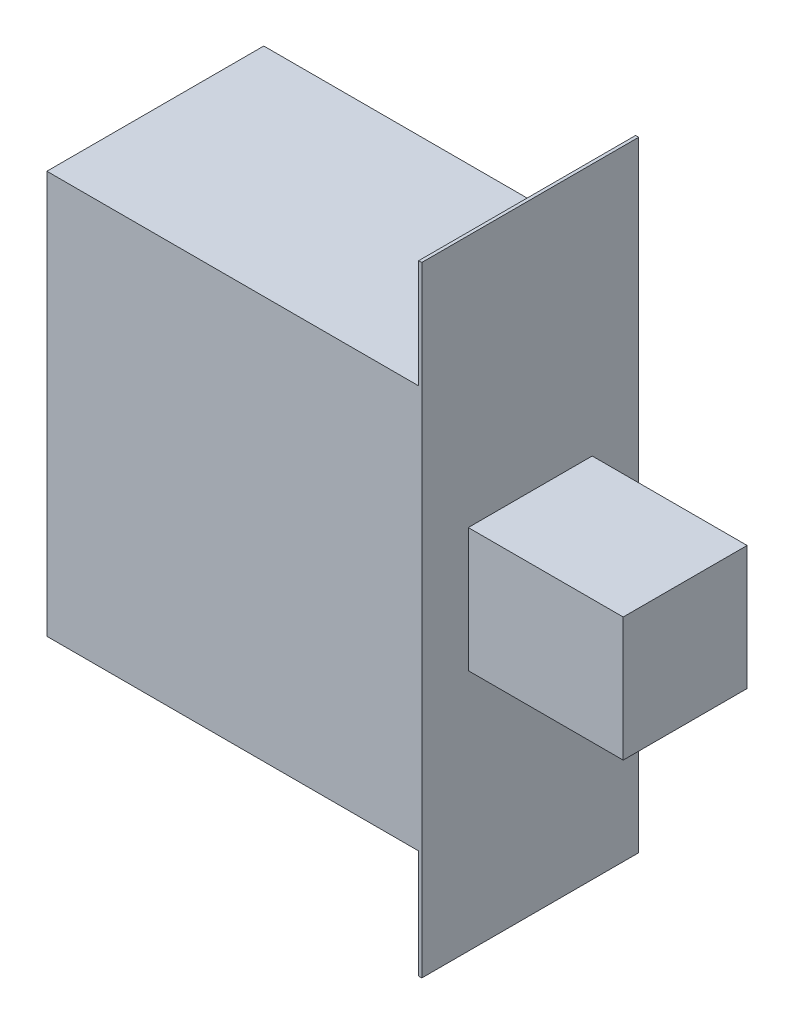
ISO-10303-21;
HEADER;
FILE_DESCRIPTION(('STEP AP214'),'2;1');
FILE_NAME('part.step','',(''),(''),'','','');
FILE_SCHEMA(('AUTOMOTIVE_DESIGN { 1 0 10303 214 1 1 1 1 }'));
ENDSEC;
DATA;
#1=APPLICATION_CONTEXT('core data for automotive mechanical design processes');
#2=APPLICATION_PROTOCOL_DEFINITION('international standard','automotive_design',2000,#1);
#3=PRODUCT_CONTEXT('',#1,'mechanical');
#4=PRODUCT('Part','Part','',(#3));
#5=PRODUCT_RELATED_PRODUCT_CATEGORY('part','',(#4));
#6=PRODUCT_DEFINITION_FORMATION('','',#4);
#7=PRODUCT_DEFINITION_CONTEXT('part definition',#1,'design');
#8=PRODUCT_DEFINITION('design','',#6,#7);
#9=PRODUCT_DEFINITION_SHAPE('','',#8);
#10=(LENGTH_UNIT() NAMED_UNIT(*) SI_UNIT(.MILLI.,.METRE.));
#11=(NAMED_UNIT(*) PLANE_ANGLE_UNIT() SI_UNIT($,.RADIAN.));
#12=(NAMED_UNIT(*) SI_UNIT($,.STERADIAN.) SOLID_ANGLE_UNIT());
#13=UNCERTAINTY_MEASURE_WITH_UNIT(LENGTH_MEASURE(1.E-05),#10,'distance_accuracy_value','');
#14=(GEOMETRIC_REPRESENTATION_CONTEXT(3) GLOBAL_UNCERTAINTY_ASSIGNED_CONTEXT((#13)) GLOBAL_UNIT_ASSIGNED_CONTEXT((#10,
#11,#12)) REPRESENTATION_CONTEXT('',''));
#15=CARTESIAN_POINT('',(0.,0.,0.));
#16=DIRECTION('',(0.,0.,1.));
#17=DIRECTION('',(1.,0.,0.));
#18=AXIS2_PLACEMENT_3D('',#15,#16,#17);
#19=CARTESIAN_POINT('',(12.1,0.,0.));
#20=DIRECTION('',(1.,0.,0.));
#21=DIRECTION('',(0.,0.,-1.));
#22=AXIS2_PLACEMENT_3D('',#19,#20,#21);
#23=PLANE('',#22);
#24=DIRECTION('',(0.,-1.,0.));
#25=VECTOR('',#24,1.);
#26=CARTESIAN_POINT('',(12.1,16.5,7.));
#27=LINE('',#26,#25);
#28=CARTESIAN_POINT('',(12.1,16.5,7.));
#29=VERTEX_POINT('',#28);
#30=CARTESIAN_POINT('',(12.1,-3.5,7.));
#31=VERTEX_POINT('',#30);
#32=EDGE_CURVE('E164',#29,#31,#27,.T.);
#33=ORIENTED_EDGE('',*,*,#32,.T.);
#34=DIRECTION('',(0.,0.,-1.));
#35=VECTOR('',#34,1.);
#36=CARTESIAN_POINT('',(12.1,-3.5,7.));
#37=LINE('',#36,#35);
#38=CARTESIAN_POINT('',(12.1,-3.5,0.));
#39=VERTEX_POINT('',#38);
#40=EDGE_CURVE('E167',#31,#39,#37,.T.);
#41=ORIENTED_EDGE('',*,*,#40,.T.);
#42=DIRECTION('',(0.,1.,0.));
#43=VECTOR('',#42,1.);
#44=CARTESIAN_POINT('',(12.1,16.5,0.));
#45=LINE('',#44,#43);
#46=CARTESIAN_POINT('',(12.1,16.5,0.));
#47=VERTEX_POINT('',#46);
#48=EDGE_CURVE('E170',#39,#47,#45,.T.);
#49=ORIENTED_EDGE('',*,*,#48,.T.);
#50=DIRECTION('',(0.,0.,1.));
#51=VECTOR('',#50,1.);
#52=CARTESIAN_POINT('',(12.1,16.5,7.));
#53=LINE('',#52,#51);
#54=EDGE_CURVE('E172',#47,#29,#53,.T.);
#55=ORIENTED_EDGE('',*,*,#54,.T.);
#56=EDGE_LOOP('',(#33,#41,#49,#55));
#57=FACE_BOUND('',#56,.T.);
#58=DIRECTION('',(0.,0.,-1.));
#59=VECTOR('',#58,1.);
#60=CARTESIAN_POINT('',(12.1,4.34028297338191,5.5));
#61=LINE('',#60,#59);
#62=CARTESIAN_POINT('',(12.1,4.34028297338191,5.5));
#63=VERTEX_POINT('',#62);
#64=CARTESIAN_POINT('',(12.1,4.34028297338191,1.5));
#65=VERTEX_POINT('',#64);
#66=EDGE_CURVE('E366',#63,#65,#61,.T.);
#67=ORIENTED_EDGE('',*,*,#66,.F.);
#68=DIRECTION('',(0.,-1.,0.));
#69=VECTOR('',#68,1.);
#70=CARTESIAN_POINT('',(12.1,8.34028297338191,5.5));
#71=LINE('',#70,#69);
#72=CARTESIAN_POINT('',(12.1,8.34028297338191,5.5));
#73=VERTEX_POINT('',#72);
#74=EDGE_CURVE('E155',#73,#63,#71,.T.);
#75=ORIENTED_EDGE('',*,*,#74,.F.);
#76=DIRECTION('',(0.,0.,1.));
#77=VECTOR('',#76,1.);
#78=CARTESIAN_POINT('',(12.1,8.34028297338191,5.5));
#79=LINE('',#78,#77);
#80=CARTESIAN_POINT('',(12.1,8.34028297338191,1.5));
#81=VERTEX_POINT('',#80);
#82=EDGE_CURVE('E151',#81,#73,#79,.T.);
#83=ORIENTED_EDGE('',*,*,#82,.F.);
#84=DIRECTION('',(0.,1.,0.));
#85=VECTOR('',#84,1.);
#86=CARTESIAN_POINT('',(12.1,8.34028297338191,1.5));
#87=LINE('',#86,#85);
#88=EDGE_CURVE('E363',#65,#81,#87,.T.);
#89=ORIENTED_EDGE('',*,*,#88,.F.);
#90=EDGE_LOOP('',(#67,#75,#83,#89));
#91=FACE_BOUND('',#90,.T.);
#92=ADVANCED_FACE('F35',(#57,#91),#23,.T.);
#93=CARTESIAN_POINT('',(0.,0.,7.));
#94=DIRECTION('',(1.,0.,0.));
#95=DIRECTION('',(0.,0.,-1.));
#96=AXIS2_PLACEMENT_3D('',#93,#94,#95);
#97=PLANE('',#96);
#98=DIRECTION('',(0.,-1.,0.));
#99=VECTOR('',#98,1.);
#100=CARTESIAN_POINT('',(0.,0.,0.));
#101=LINE('',#100,#99);
#102=CARTESIAN_POINT('',(0.,13.,0.));
#103=VERTEX_POINT('',#102);
#104=CARTESIAN_POINT('',(0.,0.,0.));
#105=VERTEX_POINT('',#104);
#106=EDGE_CURVE('E193',#103,#105,#101,.T.);
#107=ORIENTED_EDGE('',*,*,#106,.T.);
#108=DIRECTION('',(0.,0.,-1.));
#109=VECTOR('',#108,1.);
#110=CARTESIAN_POINT('',(0.,0.,7.));
#111=LINE('',#110,#109);
#112=CARTESIAN_POINT('',(0.,0.,7.));
#113=VERTEX_POINT('',#112);
#114=EDGE_CURVE('E11',#113,#105,#111,.T.);
#115=ORIENTED_EDGE('',*,*,#114,.F.);
#116=DIRECTION('',(0.,-1.,0.));
#117=VECTOR('',#116,1.);
#118=CARTESIAN_POINT('',(0.,0.,7.));
#119=LINE('',#118,#117);
#120=CARTESIAN_POINT('',(0.,13.,7.));
#121=VERTEX_POINT('',#120);
#122=EDGE_CURVE('E194',#121,#113,#119,.T.);
#123=ORIENTED_EDGE('',*,*,#122,.F.);
#124=DIRECTION('',(0.,0.,-1.));
#125=VECTOR('',#124,1.);
#126=CARTESIAN_POINT('',(0.,13.,7.));
#127=LINE('',#126,#125);
#128=EDGE_CURVE('E198',#121,#103,#127,.T.);
#129=ORIENTED_EDGE('',*,*,#128,.T.);
#130=EDGE_LOOP('',(#107,#115,#123,#129));
#131=FACE_BOUND('',#130,.T.);
#132=ADVANCED_FACE('F37',(#131),#97,.F.);
#133=CARTESIAN_POINT('',(0.,0.,7.));
#134=DIRECTION('',(0.,1.,0.));
#135=DIRECTION('',(0.,0.,1.));
#136=AXIS2_PLACEMENT_3D('',#133,#134,#135);
#137=PLANE('',#136);
#138=DIRECTION('',(1.,0.,0.));
#139=VECTOR('',#138,1.);
#140=CARTESIAN_POINT('',(0.,0.,0.));
#141=LINE('',#140,#139);
#142=CARTESIAN_POINT('',(12.,0.,0.));
#143=VERTEX_POINT('',#142);
#144=EDGE_CURVE('E201',#105,#143,#141,.T.);
#145=ORIENTED_EDGE('',*,*,#144,.T.);
#146=DIRECTION('',(0.,0.,-1.));
#147=VECTOR('',#146,1.);
#148=CARTESIAN_POINT('',(12.,0.,7.));
#149=LINE('',#148,#147);
#150=CARTESIAN_POINT('',(12.,0.,7.));
#151=VERTEX_POINT('',#150);
#152=EDGE_CURVE('E43',#151,#143,#149,.T.);
#153=ORIENTED_EDGE('',*,*,#152,.F.);
#154=DIRECTION('',(1.,0.,0.));
#155=VECTOR('',#154,1.);
#156=CARTESIAN_POINT('',(0.,0.,7.));
#157=LINE('',#156,#155);
#158=EDGE_CURVE('E83',#113,#151,#157,.T.);
#159=ORIENTED_EDGE('',*,*,#158,.F.);
#160=ORIENTED_EDGE('',*,*,#114,.T.);
#161=EDGE_LOOP('',(#145,#153,#159,#160));
#162=FACE_BOUND('',#161,.T.);
#163=ADVANCED_FACE('F226',(#162),#137,.F.);
#164=CARTESIAN_POINT('',(0.,13.,7.));
#165=DIRECTION('',(0.,-1.,0.));
#166=DIRECTION('',(0.,0.,-1.));
#167=AXIS2_PLACEMENT_3D('',#164,#165,#166);
#168=PLANE('',#167);
#169=DIRECTION('',(-1.,0.,0.));
#170=VECTOR('',#169,1.);
#171=CARTESIAN_POINT('',(0.,13.,0.));
#172=LINE('',#171,#170);
#173=CARTESIAN_POINT('',(12.,13.,0.));
#174=VERTEX_POINT('',#173);
#175=EDGE_CURVE('E76',#174,#103,#172,.T.);
#176=ORIENTED_EDGE('',*,*,#175,.T.);
#177=ORIENTED_EDGE('',*,*,#128,.F.);
#178=DIRECTION('',(-1.,0.,0.));
#179=VECTOR('',#178,1.);
#180=CARTESIAN_POINT('',(0.,13.,7.));
#181=LINE('',#180,#179);
#182=CARTESIAN_POINT('',(12.,13.,7.));
#183=VERTEX_POINT('',#182);
#184=EDGE_CURVE('E59',#183,#121,#181,.T.);
#185=ORIENTED_EDGE('',*,*,#184,.F.);
#186=DIRECTION('',(0.,0.,-1.));
#187=VECTOR('',#186,1.);
#188=CARTESIAN_POINT('',(12.,13.,7.));
#189=LINE('',#188,#187);
#190=EDGE_CURVE('E205',#183,#174,#189,.T.);
#191=ORIENTED_EDGE('',*,*,#190,.T.);
#192=EDGE_LOOP('',(#176,#177,#185,#191));
#193=FACE_BOUND('',#192,.T.);
#194=ADVANCED_FACE('F228',(#193),#168,.F.);
#195=CARTESIAN_POINT('',(0.,0.,7.));
#196=DIRECTION('',(0.,0.,-1.));
#197=DIRECTION('',(-1.,0.,0.));
#198=AXIS2_PLACEMENT_3D('',#195,#196,#197);
#199=PLANE('',#198);
#200=ORIENTED_EDGE('',*,*,#122,.T.);
#201=ORIENTED_EDGE('',*,*,#158,.T.);
#202=DIRECTION('',(0.,-1.,0.));
#203=VECTOR('',#202,1.);
#204=CARTESIAN_POINT('',(12.,16.5,7.));
#205=LINE('',#204,#203);
#206=CARTESIAN_POINT('',(12.,-3.5,7.));
#207=VERTEX_POINT('',#206);
#208=EDGE_CURVE('E157',#151,#207,#205,.T.);
#209=ORIENTED_EDGE('',*,*,#208,.T.);
#210=DIRECTION('',(-1.,0.,0.));
#211=VECTOR('',#210,1.);
#212=CARTESIAN_POINT('',(12.1,-3.5,7.));
#213=LINE('',#212,#211);
#214=EDGE_CURVE('E190',#31,#207,#213,.T.);
#215=ORIENTED_EDGE('',*,*,#214,.F.);
#216=ORIENTED_EDGE('',*,*,#32,.F.);
#217=DIRECTION('',(-1.,0.,0.));
#218=VECTOR('',#217,1.);
#219=CARTESIAN_POINT('',(12.1,16.5,7.));
#220=LINE('',#219,#218);
#221=CARTESIAN_POINT('',(12.,16.5,7.));
#222=VERTEX_POINT('',#221);
#223=EDGE_CURVE('E173',#29,#222,#220,.T.);
#224=ORIENTED_EDGE('',*,*,#223,.T.);
#225=EDGE_CURVE('E159',#222,#183,#205,.T.);
#226=ORIENTED_EDGE('',*,*,#225,.T.);
#227=ORIENTED_EDGE('',*,*,#184,.T.);
#228=EDGE_LOOP('',(#200,#201,#209,#215,#216,#224,#226,#227));
#229=FACE_BOUND('',#228,.T.);
#230=ADVANCED_FACE('F222',(#229),#199,.F.);
#231=CARTESIAN_POINT('',(0.,0.,0.));
#232=DIRECTION('',(0.,0.,-1.));
#233=DIRECTION('',(-1.,0.,0.));
#234=AXIS2_PLACEMENT_3D('',#231,#232,#233);
#235=PLANE('',#234);
#236=ORIENTED_EDGE('',*,*,#106,.F.);
#237=ORIENTED_EDGE('',*,*,#175,.F.);
#238=DIRECTION('',(0.,1.,0.));
#239=VECTOR('',#238,1.);
#240=CARTESIAN_POINT('',(12.,16.5,0.));
#241=LINE('',#240,#239);
#242=CARTESIAN_POINT('',(12.,16.5,0.));
#243=VERTEX_POINT('',#242);
#244=EDGE_CURVE('E177',#174,#243,#241,.T.);
#245=ORIENTED_EDGE('',*,*,#244,.T.);
#246=DIRECTION('',(-1.,0.,0.));
#247=VECTOR('',#246,1.);
#248=CARTESIAN_POINT('',(12.1,16.5,0.));
#249=LINE('',#248,#247);
#250=EDGE_CURVE('E184',#47,#243,#249,.T.);
#251=ORIENTED_EDGE('',*,*,#250,.F.);
#252=ORIENTED_EDGE('',*,*,#48,.F.);
#253=DIRECTION('',(-1.,0.,0.));
#254=VECTOR('',#253,1.);
#255=CARTESIAN_POINT('',(12.1,-3.5,0.));
#256=LINE('',#255,#254);
#257=CARTESIAN_POINT('',(12.,-3.5,0.));
#258=VERTEX_POINT('',#257);
#259=EDGE_CURVE('E187',#39,#258,#256,.T.);
#260=ORIENTED_EDGE('',*,*,#259,.T.);
#261=EDGE_CURVE('E178',#258,#143,#241,.T.);
#262=ORIENTED_EDGE('',*,*,#261,.T.);
#263=ORIENTED_EDGE('',*,*,#144,.F.);
#264=EDGE_LOOP('',(#236,#237,#245,#251,#252,#260,#262,#263));
#265=FACE_BOUND('',#264,.T.);
#266=ADVANCED_FACE('F214',(#265),#235,.T.);
#267=CARTESIAN_POINT('',(12.,0.,0.));
#268=DIRECTION('',(1.,0.,0.));
#269=DIRECTION('',(0.,0.,-1.));
#270=AXIS2_PLACEMENT_3D('',#267,#268,#269);
#271=PLANE('',#270);
#272=ORIENTED_EDGE('',*,*,#208,.F.);
#273=ORIENTED_EDGE('',*,*,#152,.T.);
#274=ORIENTED_EDGE('',*,*,#261,.F.);
#275=DIRECTION('',(0.,0.,-1.));
#276=VECTOR('',#275,1.);
#277=CARTESIAN_POINT('',(12.,-3.5,7.));
#278=LINE('',#277,#276);
#279=EDGE_CURVE('E175',#207,#258,#278,.T.);
#280=ORIENTED_EDGE('',*,*,#279,.F.);
#281=EDGE_LOOP('',(#272,#273,#274,#280));
#282=FACE_BOUND('',#281,.T.);
#283=ADVANCED_FACE('F210',(#282),#271,.F.);
#284=CARTESIAN_POINT('',(12.1,-3.5,7.));
#285=DIRECTION('',(0.,1.,0.));
#286=DIRECTION('',(0.,0.,1.));
#287=AXIS2_PLACEMENT_3D('',#284,#285,#286);
#288=PLANE('',#287);
#289=ORIENTED_EDGE('',*,*,#279,.T.);
#290=ORIENTED_EDGE('',*,*,#259,.F.);
#291=ORIENTED_EDGE('',*,*,#40,.F.);
#292=ORIENTED_EDGE('',*,*,#214,.T.);
#293=EDGE_LOOP('',(#289,#290,#291,#292));
#294=FACE_BOUND('',#293,.T.);
#295=ADVANCED_FACE('F219',(#294),#288,.F.);
#296=CARTESIAN_POINT('',(12.1,16.5,7.));
#297=DIRECTION('',(0.,-1.,0.));
#298=DIRECTION('',(0.,0.,-1.));
#299=AXIS2_PLACEMENT_3D('',#296,#297,#298);
#300=PLANE('',#299);
#301=DIRECTION('',(0.,0.,1.));
#302=VECTOR('',#301,1.);
#303=CARTESIAN_POINT('',(12.,16.5,7.));
#304=LINE('',#303,#302);
#305=EDGE_CURVE('E168',#243,#222,#304,.T.);
#306=ORIENTED_EDGE('',*,*,#305,.T.);
#307=ORIENTED_EDGE('',*,*,#223,.F.);
#308=ORIENTED_EDGE('',*,*,#54,.F.);
#309=ORIENTED_EDGE('',*,*,#250,.T.);
#310=EDGE_LOOP('',(#306,#307,#308,#309));
#311=FACE_BOUND('',#310,.T.);
#312=ADVANCED_FACE('F246',(#311),#300,.F.);
#313=ORIENTED_EDGE('',*,*,#190,.F.);
#314=ORIENTED_EDGE('',*,*,#225,.F.);
#315=ORIENTED_EDGE('',*,*,#305,.F.);
#316=ORIENTED_EDGE('',*,*,#244,.F.);
#317=EDGE_LOOP('',(#313,#314,#315,#316));
#318=FACE_BOUND('',#317,.T.);
#319=ADVANCED_FACE('F243',(#318),#271,.F.);
#320=CARTESIAN_POINT('',(17.1,8.34028297338191,5.5));
#321=DIRECTION('',(0.,0.,-1.));
#322=DIRECTION('',(0.,1.,0.));
#323=AXIS2_PLACEMENT_3D('',#320,#321,#322);
#324=PLANE('',#323);
#325=ORIENTED_EDGE('',*,*,#74,.T.);
#326=DIRECTION('',(-1.,0.,0.));
#327=VECTOR('',#326,1.);
#328=CARTESIAN_POINT('',(17.1,4.34028297338191,5.5));
#329=LINE('',#328,#327);
#330=CARTESIAN_POINT('',(17.1,4.34028297338191,5.5));
#331=VERTEX_POINT('',#330);
#332=EDGE_CURVE('E136',#331,#63,#329,.T.);
#333=ORIENTED_EDGE('',*,*,#332,.F.);
#334=DIRECTION('',(0.,-1.,0.));
#335=VECTOR('',#334,1.);
#336=CARTESIAN_POINT('',(17.1,8.34028297338191,5.5));
#337=LINE('',#336,#335);
#338=CARTESIAN_POINT('',(17.1,8.34028297338191,5.5));
#339=VERTEX_POINT('',#338);
#340=EDGE_CURVE('E143',#339,#331,#337,.T.);
#341=ORIENTED_EDGE('',*,*,#340,.F.);
#342=DIRECTION('',(-1.,0.,0.));
#343=VECTOR('',#342,1.);
#344=CARTESIAN_POINT('',(17.1,8.34028297338191,5.5));
#345=LINE('',#344,#343);
#346=EDGE_CURVE('E361',#339,#73,#345,.T.);
#347=ORIENTED_EDGE('',*,*,#346,.T.);
#348=EDGE_LOOP('',(#325,#333,#341,#347));
#349=FACE_BOUND('',#348,.T.);
#350=ADVANCED_FACE('F153',(#349),#324,.F.);
#351=CARTESIAN_POINT('',(17.1,4.34028297338191,5.5));
#352=DIRECTION('',(0.,1.,0.));
#353=DIRECTION('',(0.,0.,1.));
#354=AXIS2_PLACEMENT_3D('',#351,#352,#353);
#355=PLANE('',#354);
#356=ORIENTED_EDGE('',*,*,#66,.T.);
#357=DIRECTION('',(-1.,0.,0.));
#358=VECTOR('',#357,1.);
#359=CARTESIAN_POINT('',(17.1,4.34028297338191,1.5));
#360=LINE('',#359,#358);
#361=CARTESIAN_POINT('',(17.1,4.34028297338191,1.5));
#362=VERTEX_POINT('',#361);
#363=EDGE_CURVE('E139',#362,#65,#360,.T.);
#364=ORIENTED_EDGE('',*,*,#363,.F.);
#365=DIRECTION('',(0.,0.,-1.));
#366=VECTOR('',#365,1.);
#367=CARTESIAN_POINT('',(17.1,4.34028297338191,5.5));
#368=LINE('',#367,#366);
#369=EDGE_CURVE('E132',#331,#362,#368,.T.);
#370=ORIENTED_EDGE('',*,*,#369,.F.);
#371=ORIENTED_EDGE('',*,*,#332,.T.);
#372=EDGE_LOOP('',(#356,#364,#370,#371));
#373=FACE_BOUND('',#372,.T.);
#374=ADVANCED_FACE('F134',(#373),#355,.F.);
#375=CARTESIAN_POINT('',(17.1,8.34028297338191,1.5));
#376=DIRECTION('',(0.,0.,1.));
#377=DIRECTION('',(0.,-1.,0.));
#378=AXIS2_PLACEMENT_3D('',#375,#376,#377);
#379=PLANE('',#378);
#380=ORIENTED_EDGE('',*,*,#88,.T.);
#381=DIRECTION('',(-1.,0.,0.));
#382=VECTOR('',#381,1.);
#383=CARTESIAN_POINT('',(17.1,8.34028297338191,1.5));
#384=LINE('',#383,#382);
#385=CARTESIAN_POINT('',(17.1,8.34028297338191,1.5));
#386=VERTEX_POINT('',#385);
#387=EDGE_CURVE('E50',#386,#81,#384,.T.);
#388=ORIENTED_EDGE('',*,*,#387,.F.);
#389=DIRECTION('',(0.,1.,0.));
#390=VECTOR('',#389,1.);
#391=CARTESIAN_POINT('',(17.1,8.34028297338191,1.5));
#392=LINE('',#391,#390);
#393=EDGE_CURVE('E142',#362,#386,#392,.T.);
#394=ORIENTED_EDGE('',*,*,#393,.F.);
#395=ORIENTED_EDGE('',*,*,#363,.T.);
#396=EDGE_LOOP('',(#380,#388,#394,#395));
#397=FACE_BOUND('',#396,.T.);
#398=ADVANCED_FACE('F284',(#397),#379,.F.);
#399=CARTESIAN_POINT('',(17.1,8.34028297338191,5.5));
#400=DIRECTION('',(0.,-1.,0.));
#401=DIRECTION('',(0.,0.,-1.));
#402=AXIS2_PLACEMENT_3D('',#399,#400,#401);
#403=PLANE('',#402);
#404=ORIENTED_EDGE('',*,*,#82,.T.);
#405=ORIENTED_EDGE('',*,*,#346,.F.);
#406=DIRECTION('',(0.,0.,1.));
#407=VECTOR('',#406,1.);
#408=CARTESIAN_POINT('',(17.1,8.34028297338191,5.5));
#409=LINE('',#408,#407);
#410=EDGE_CURVE('E147',#386,#339,#409,.T.);
#411=ORIENTED_EDGE('',*,*,#410,.F.);
#412=ORIENTED_EDGE('',*,*,#387,.T.);
#413=EDGE_LOOP('',(#404,#405,#411,#412));
#414=FACE_BOUND('',#413,.T.);
#415=ADVANCED_FACE('F290',(#414),#403,.F.);
#416=CARTESIAN_POINT('',(17.1,0.,0.));
#417=DIRECTION('',(1.,0.,0.));
#418=DIRECTION('',(0.,0.,-1.));
#419=AXIS2_PLACEMENT_3D('',#416,#417,#418);
#420=PLANE('',#419);
#421=ORIENTED_EDGE('',*,*,#340,.T.);
#422=ORIENTED_EDGE('',*,*,#369,.T.);
#423=ORIENTED_EDGE('',*,*,#393,.T.);
#424=ORIENTED_EDGE('',*,*,#410,.T.);
#425=EDGE_LOOP('',(#421,#422,#423,#424));
#426=FACE_BOUND('',#425,.T.);
#427=ADVANCED_FACE('F146',(#426),#420,.T.);
#428=CLOSED_SHELL('',(#92,#132,#163,#194,#230,#266,#283,#295,#312,#319,#350,#374,#398,#415,#427));
#429=MANIFOLD_SOLID_BREP('B2',#428);
#430=ADVANCED_BREP_SHAPE_REPRESENTATION('',(#18,#429),#14);
#431=SHAPE_DEFINITION_REPRESENTATION(#9,#430);
ENDSEC;
END-ISO-10303-21;
